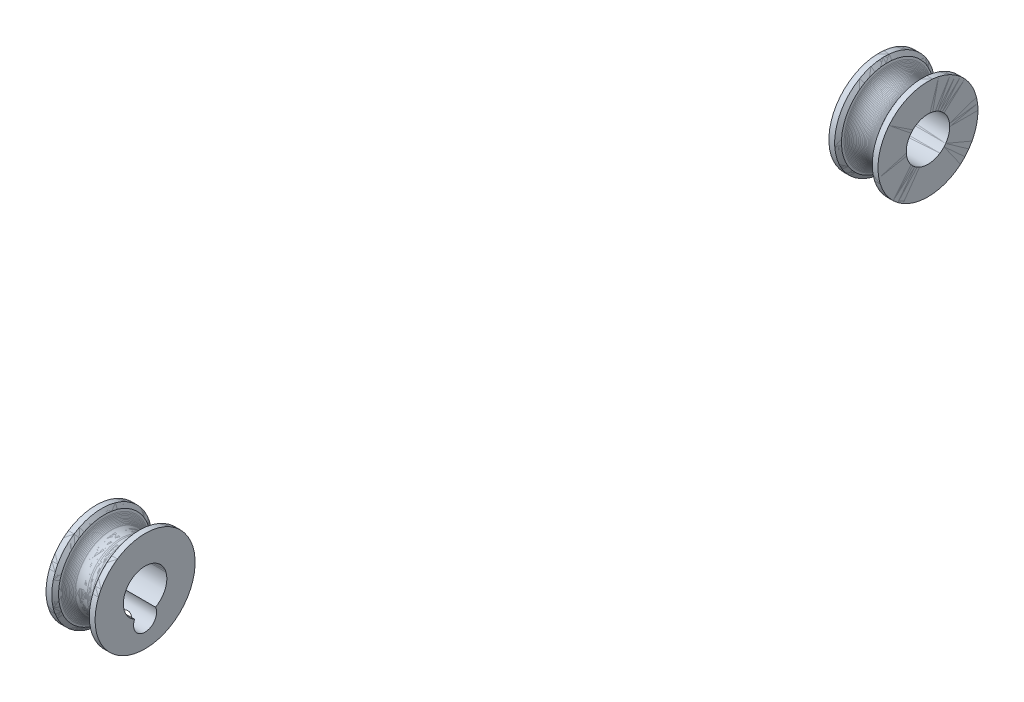
ISO-10303-21;
HEADER;
FILE_DESCRIPTION(('STEP AP214'),'2;1');
FILE_NAME('part.step','',(''),(''),'','','');
FILE_SCHEMA(('AUTOMOTIVE_DESIGN { 1 0 10303 214 1 1 1 1 }'));
ENDSEC;
DATA;
#1=APPLICATION_CONTEXT('core data for automotive mechanical design processes');
#2=APPLICATION_PROTOCOL_DEFINITION('international standard','automotive_design',2000,#1);
#3=PRODUCT_CONTEXT('',#1,'mechanical');
#4=PRODUCT('Part','Part','',(#3));
#5=PRODUCT_RELATED_PRODUCT_CATEGORY('part','',(#4));
#6=PRODUCT_DEFINITION_FORMATION('','',#4);
#7=PRODUCT_DEFINITION_CONTEXT('part definition',#1,'design');
#8=PRODUCT_DEFINITION('design','',#6,#7);
#9=PRODUCT_DEFINITION_SHAPE('','',#8);
#10=(LENGTH_UNIT() NAMED_UNIT(*) SI_UNIT(.MILLI.,.METRE.));
#11=(NAMED_UNIT(*) PLANE_ANGLE_UNIT() SI_UNIT($,.RADIAN.));
#12=(NAMED_UNIT(*) SI_UNIT($,.STERADIAN.) SOLID_ANGLE_UNIT());
#13=UNCERTAINTY_MEASURE_WITH_UNIT(LENGTH_MEASURE(1.E-05),#10,'distance_accuracy_value','');
#14=(GEOMETRIC_REPRESENTATION_CONTEXT(3) GLOBAL_UNCERTAINTY_ASSIGNED_CONTEXT((#13)) GLOBAL_UNIT_ASSIGNED_CONTEXT((#10,
#11,#12)) REPRESENTATION_CONTEXT('',''));
#15=CARTESIAN_POINT('',(0.,0.,0.));
#16=DIRECTION('',(0.,0.,1.));
#17=DIRECTION('',(1.,0.,0.));
#18=AXIS2_PLACEMENT_3D('',#15,#16,#17);
#19=CARTESIAN_POINT('',(102.4128,-70.8025,2.22250000000007));
#20=DIRECTION('',(1.,0.,0.));
#21=DIRECTION('',(0.,0.,1.));
#22=AXIS2_PLACEMENT_3D('',#19,#20,#21);
#23=PLANE('',#22);
#24=CARTESIAN_POINT('',(102.4128,-70.8025,12.7));
#25=DIRECTION('',(1.,0.,0.));
#26=DIRECTION('',(0.,0.,-1.));
#27=AXIS2_PLACEMENT_3D('',#24,#25,#26);
#28=CIRCLE('',#27,6.35);
#29=CARTESIAN_POINT('',(102.4128,-70.8025,6.35));
#30=VERTEX_POINT('',#29);
#31=EDGE_CURVE('P0_E43',#30,#30,#28,.T.);
#32=ORIENTED_EDGE('',*,*,#31,.F.);
#33=EDGE_LOOP('',(#32));
#34=FACE_BOUND('',#33,.T.);
#35=CARTESIAN_POINT('',(102.4128,-70.8025,12.7));
#36=DIRECTION('',(1.,0.,0.));
#37=DIRECTION('',(0.,0.,-1.));
#38=AXIS2_PLACEMENT_3D('',#35,#36,#37);
#39=CIRCLE('',#38,14.605);
#40=CARTESIAN_POINT('',(102.4128,-70.8025,-1.905));
#41=VERTEX_POINT('',#40);
#42=EDGE_CURVE('P0_E10',#41,#41,#39,.T.);
#43=ORIENTED_EDGE('',*,*,#42,.T.);
#44=EDGE_LOOP('',(#43));
#45=FACE_BOUND('',#44,.T.);
#46=ADVANCED_FACE('P0_F15',(#34,#45),#23,.T.);
#47=CARTESIAN_POINT('',(95.25,-70.8025,12.7));
#48=DIRECTION('',(-1.,0.,0.));
#49=DIRECTION('',(0.,0.,-1.));
#50=AXIS2_PLACEMENT_3D('',#47,#48,#49);
#51=CYLINDRICAL_SURFACE('',#50,14.605);
#52=ORIENTED_EDGE('',*,*,#42,.F.);
#53=EDGE_LOOP('',(#52));
#54=FACE_BOUND('',#53,.T.);
#55=CARTESIAN_POINT('',(100.7364,-70.8025,12.7));
#56=DIRECTION('',(1.,0.,0.));
#57=DIRECTION('',(0.,0.,-1.));
#58=AXIS2_PLACEMENT_3D('',#55,#56,#57);
#59=CIRCLE('',#58,14.605);
#60=CARTESIAN_POINT('',(100.7364,-70.8025,-1.905));
#61=VERTEX_POINT('',#60);
#62=EDGE_CURVE('P0_E21',#61,#61,#59,.T.);
#63=ORIENTED_EDGE('',*,*,#62,.T.);
#64=EDGE_LOOP('',(#63));
#65=FACE_BOUND('',#64,.T.);
#66=ADVANCED_FACE('P0_F50',(#54,#65),#51,.T.);
#67=CARTESIAN_POINT('',(100.7364,-70.8025,12.7));
#68=DIRECTION('',(1.,0.,0.));
#69=DIRECTION('',(0.,0.,1.));
#70=AXIS2_PLACEMENT_3D('',#67,#68,#69);
#71=CONICAL_SURFACE('',#70,14.605,0.938047491792709);
#72=CARTESIAN_POINT('',(99.8982,-70.8025,12.7));
#73=DIRECTION('',(1.,0.,0.));
#74=DIRECTION('',(0.,0.,-1.));
#75=AXIS2_PLACEMENT_3D('',#72,#73,#74);
#76=CIRCLE('',#75,13.462);
#77=CARTESIAN_POINT('',(99.8982,-70.8025,-0.762000000000001));
#78=VERTEX_POINT('',#77);
#79=EDGE_CURVE('P0_E25',#78,#78,#76,.T.);
#80=ORIENTED_EDGE('',*,*,#79,.T.);
#81=EDGE_LOOP('',(#80));
#82=FACE_BOUND('',#81,.T.);
#83=ORIENTED_EDGE('',*,*,#62,.F.);
#84=EDGE_LOOP('',(#83));
#85=FACE_BOUND('',#84,.T.);
#86=ADVANCED_FACE('P0_F55',(#82,#85),#71,.T.);
#87=CARTESIAN_POINT('',(95.25,-70.8025,12.7));
#88=DIRECTION('',(-1.,0.,0.));
#89=DIRECTION('',(0.,0.,-1.));
#90=AXIS2_PLACEMENT_3D('',#87,#88,#89);
#91=TOROIDAL_SURFACE('',#90,14.605,4.78667026647959);
#92=ORIENTED_EDGE('',*,*,#79,.F.);
#93=EDGE_LOOP('',(#92));
#94=FACE_BOUND('',#93,.T.);
#95=CARTESIAN_POINT('',(90.6018,-70.8025,12.7));
#96=DIRECTION('',(1.,0.,0.));
#97=DIRECTION('',(0.,0.,-1.));
#98=AXIS2_PLACEMENT_3D('',#95,#96,#97);
#99=CIRCLE('',#98,13.462);
#100=CARTESIAN_POINT('',(90.6018,-70.8025,-0.762000000000001));
#101=VERTEX_POINT('',#100);
#102=EDGE_CURVE('P0_E29',#101,#101,#99,.T.);
#103=ORIENTED_EDGE('',*,*,#102,.T.);
#104=EDGE_LOOP('',(#103));
#105=FACE_BOUND('',#104,.T.);
#106=ADVANCED_FACE('P0_F60',(#94,#105),#91,.F.);
#107=CARTESIAN_POINT('',(89.7636,-70.8025,12.7));
#108=DIRECTION('',(-1.,0.,0.));
#109=DIRECTION('',(0.,0.,-1.));
#110=AXIS2_PLACEMENT_3D('',#107,#108,#109);
#111=CONICAL_SURFACE('',#110,14.605,0.938047491792693);
#112=ORIENTED_EDGE('',*,*,#102,.F.);
#113=EDGE_LOOP('',(#112));
#114=FACE_BOUND('',#113,.T.);
#115=CARTESIAN_POINT('',(89.7636,-70.8025,12.7));
#116=DIRECTION('',(1.,0.,0.));
#117=DIRECTION('',(0.,0.,-1.));
#118=AXIS2_PLACEMENT_3D('',#115,#116,#117);
#119=CIRCLE('',#118,14.605);
#120=CARTESIAN_POINT('',(89.7636,-70.8025,-1.905));
#121=VERTEX_POINT('',#120);
#122=EDGE_CURVE('P0_E34',#121,#121,#119,.T.);
#123=ORIENTED_EDGE('',*,*,#122,.T.);
#124=EDGE_LOOP('',(#123));
#125=FACE_BOUND('',#124,.T.);
#126=ADVANCED_FACE('P0_F66',(#114,#125),#111,.T.);
#127=CARTESIAN_POINT('',(95.25,-70.8025,12.7));
#128=DIRECTION('',(-1.,0.,0.));
#129=DIRECTION('',(0.,0.,-1.));
#130=AXIS2_PLACEMENT_3D('',#127,#128,#129);
#131=CYLINDRICAL_SURFACE('',#130,14.605);
#132=ORIENTED_EDGE('',*,*,#122,.F.);
#133=EDGE_LOOP('',(#132));
#134=FACE_BOUND('',#133,.T.);
#135=CARTESIAN_POINT('',(88.0872,-70.8025,12.7));
#136=DIRECTION('',(1.,0.,0.));
#137=DIRECTION('',(0.,0.,-1.));
#138=AXIS2_PLACEMENT_3D('',#135,#136,#137);
#139=CIRCLE('',#138,14.605);
#140=CARTESIAN_POINT('',(88.0872,-70.8025,-1.905));
#141=VERTEX_POINT('',#140);
#142=EDGE_CURVE('P0_E37',#141,#141,#139,.T.);
#143=ORIENTED_EDGE('',*,*,#142,.T.);
#144=EDGE_LOOP('',(#143));
#145=FACE_BOUND('',#144,.T.);
#146=ADVANCED_FACE('P0_F70',(#134,#145),#131,.T.);
#147=CARTESIAN_POINT('',(88.0872,-70.8025,2.22250000000007));
#148=DIRECTION('',(-1.,0.,0.));
#149=DIRECTION('',(0.,0.,-1.));
#150=AXIS2_PLACEMENT_3D('',#147,#148,#149);
#151=PLANE('',#150);
#152=ORIENTED_EDGE('',*,*,#142,.F.);
#153=EDGE_LOOP('',(#152));
#154=FACE_BOUND('',#153,.T.);
#155=CARTESIAN_POINT('',(88.0872,-70.8025,12.7));
#156=DIRECTION('',(1.,0.,0.));
#157=DIRECTION('',(0.,0.,-1.));
#158=AXIS2_PLACEMENT_3D('',#155,#156,#157);
#159=CIRCLE('',#158,6.35);
#160=CARTESIAN_POINT('',(88.0872,-70.8025,6.35));
#161=VERTEX_POINT('',#160);
#162=EDGE_CURVE('P0_E40',#161,#161,#159,.T.);
#163=ORIENTED_EDGE('',*,*,#162,.T.);
#164=EDGE_LOOP('',(#163));
#165=FACE_BOUND('',#164,.T.);
#166=ADVANCED_FACE('P0_F74',(#154,#165),#151,.T.);
#167=CARTESIAN_POINT('',(95.25,-70.8025,12.7));
#168=DIRECTION('',(-1.,0.,0.));
#169=DIRECTION('',(0.,0.,-1.));
#170=AXIS2_PLACEMENT_3D('',#167,#168,#169);
#171=CYLINDRICAL_SURFACE('',#170,6.35);
#172=ORIENTED_EDGE('',*,*,#162,.F.);
#173=EDGE_LOOP('',(#172));
#174=FACE_BOUND('',#173,.T.);
#175=ORIENTED_EDGE('',*,*,#31,.T.);
#176=EDGE_LOOP('',(#175));
#177=FACE_BOUND('',#176,.T.);
#178=ADVANCED_FACE('P0_F47',(#174,#177),#171,.F.);
#179=CLOSED_SHELL('',(#46,#66,#86,#106,#126,#146,#166,#178));
#180=MANIFOLD_SOLID_BREP('P0_B1',#179);
#181=CARTESIAN_POINT('',(102.4128,-70.8025,251.7775));
#182=DIRECTION('',(1.,0.,0.));
#183=DIRECTION('',(0.,0.,-1.));
#184=AXIS2_PLACEMENT_3D('',#181,#182,#183);
#185=PLANE('',#184);
#186=CARTESIAN_POINT('',(102.4128,-77.7875,241.3));
#187=DIRECTION('',(1.,0.,0.));
#188=DIRECTION('',(0.,0.,-1.));
#189=AXIS2_PLACEMENT_3D('',#186,#187,#188);
#190=CIRCLE('',#189,3.3655);
#191=CARTESIAN_POINT('',(102.4128,-76.3705840909091,244.352693819656));
#192=VERTEX_POINT('',#191);
#193=CARTESIAN_POINT('',(102.4128,-76.370584090909,238.247306180344));
#194=VERTEX_POINT('',#193);
#195=EDGE_CURVE('P1_E30',#192,#194,#190,.T.);
#196=ORIENTED_EDGE('',*,*,#195,.F.);
#197=CARTESIAN_POINT('',(102.4128,-70.8025,241.3));
#198=DIRECTION('',(-1.,0.,0.));
#199=DIRECTION('',(0.,0.,1.));
#200=AXIS2_PLACEMENT_3D('',#197,#198,#199);
#201=CIRCLE('',#200,6.35);
#202=EDGE_CURVE('P1_E54',#192,#194,#201,.T.);
#203=ORIENTED_EDGE('',*,*,#202,.T.);
#204=EDGE_LOOP('',(#196,#203));
#205=FACE_BOUND('',#204,.T.);
#206=CARTESIAN_POINT('',(102.4128,-70.8025,241.3));
#207=DIRECTION('',(-1.,0.,0.));
#208=DIRECTION('',(0.,0.,1.));
#209=AXIS2_PLACEMENT_3D('',#206,#207,#208);
#210=CIRCLE('',#209,14.605);
#211=CARTESIAN_POINT('',(102.4128,-70.8025,255.905));
#212=VERTEX_POINT('',#211);
#213=EDGE_CURVE('P1_E45',#212,#212,#210,.T.);
#214=ORIENTED_EDGE('',*,*,#213,.F.);
#215=EDGE_LOOP('',(#214));
#216=FACE_BOUND('',#215,.T.);
#217=ADVANCED_FACE('P1_F17',(#205,#216),#185,.T.);
#218=CARTESIAN_POINT('',(95.25,-70.8025,241.3));
#219=DIRECTION('',(-1.,0.,0.));
#220=DIRECTION('',(0.,0.,1.));
#221=AXIS2_PLACEMENT_3D('',#218,#219,#220);
#222=CYLINDRICAL_SURFACE('',#221,14.605);
#223=ORIENTED_EDGE('',*,*,#213,.T.);
#224=EDGE_LOOP('',(#223));
#225=FACE_BOUND('',#224,.T.);
#226=CARTESIAN_POINT('',(100.7364,-70.8025,241.3));
#227=DIRECTION('',(-1.,0.,0.));
#228=DIRECTION('',(0.,0.,1.));
#229=AXIS2_PLACEMENT_3D('',#226,#227,#228);
#230=CIRCLE('',#229,14.605);
#231=CARTESIAN_POINT('',(100.7364,-70.8025,255.905));
#232=VERTEX_POINT('',#231);
#233=EDGE_CURVE('P1_E71',#232,#232,#230,.T.);
#234=ORIENTED_EDGE('',*,*,#233,.F.);
#235=EDGE_LOOP('',(#234));
#236=FACE_BOUND('',#235,.T.);
#237=ADVANCED_FACE('P1_F77',(#225,#236),#222,.T.);
#238=CARTESIAN_POINT('',(100.7364,-70.8025,241.3));
#239=DIRECTION('',(1.,0.,0.));
#240=DIRECTION('',(0.,0.,-1.));
#241=AXIS2_PLACEMENT_3D('',#238,#239,#240);
#242=CONICAL_SURFACE('',#241,14.605,0.938047491792709);
#243=CARTESIAN_POINT('',(99.8982,-70.8025,241.3));
#244=DIRECTION('',(-1.,0.,0.));
#245=DIRECTION('',(0.,0.,1.));
#246=AXIS2_PLACEMENT_3D('',#243,#244,#245);
#247=CIRCLE('',#246,13.462);
#248=CARTESIAN_POINT('',(99.8982,-70.8025,254.762));
#249=VERTEX_POINT('',#248);
#250=EDGE_CURVE('P1_E68',#249,#249,#247,.T.);
#251=ORIENTED_EDGE('',*,*,#250,.F.);
#252=EDGE_LOOP('',(#251));
#253=FACE_BOUND('',#252,.T.);
#254=ORIENTED_EDGE('',*,*,#233,.T.);
#255=EDGE_LOOP('',(#254));
#256=FACE_BOUND('',#255,.T.);
#257=ADVANCED_FACE('P1_F86',(#253,#256),#242,.T.);
#258=CARTESIAN_POINT('',(95.25,-70.8025,241.3));
#259=DIRECTION('',(-1.,0.,0.));
#260=DIRECTION('',(0.,0.,1.));
#261=AXIS2_PLACEMENT_3D('',#258,#259,#260);
#262=TOROIDAL_SURFACE('',#261,14.605,4.78667026647959);
#263=CARTESIAN_POINT('',(93.3120294666594,-80.9728268727951,240.213591722796));
#264=CARTESIAN_POINT('',(93.3650081354483,-80.9384745240016,240.112902921795));
#265=CARTESIAN_POINT('',(93.4262302791657,-80.9005715965524,240.017531788477));
#266=CARTESIAN_POINT('',(93.5643537012766,-80.8214811289982,239.840187384882));
#267=CARTESIAN_POINT('',(93.6412959510597,-80.780285180646,239.758250154342));
#268=CARTESIAN_POINT('',(93.8090927841571,-80.6990199159641,239.609793422558));
#269=CARTESIAN_POINT('',(93.8999232058517,-80.6589487833693,239.54324764012));
#270=CARTESIAN_POINT('',(94.0932034124341,-80.5839858591219,239.426204486387));
#271=CARTESIAN_POINT('',(94.1956467656807,-80.5490912250312,239.375698290174));
#272=CARTESIAN_POINT('',(94.4079910630382,-80.4882341398288,239.291190635299));
#273=CARTESIAN_POINT('',(94.5177834373758,-80.4621660176732,239.256991759265));
#274=CARTESIAN_POINT('',(94.7429378272002,-80.4206779582629,239.203786894585));
#275=CARTESIAN_POINT('',(94.858301278688,-80.4052607822399,239.184784845478));
#276=CARTESIAN_POINT('',(95.0943872180407,-80.3861420864803,239.161334268545));
#277=CARTESIAN_POINT('',(95.2151715912685,-80.3827427366672,239.1572610115));
#278=CARTESIAN_POINT('',(95.4559507302906,-80.3887928972979,239.164611079543));
#279=CARTESIAN_POINT('',(95.5759454398539,-80.3982433130201,239.176035496457));
#280=CARTESIAN_POINT('',(95.8129516793368,-80.4293360288543,239.214834991924));
#281=CARTESIAN_POINT('',(95.9299222156635,-80.4510974282141,239.242365979257));
#282=CARTESIAN_POINT('',(96.1561894315912,-80.5048906302805,239.31395642246));
#283=CARTESIAN_POINT('',(96.2654873566333,-80.5369207614151,239.358013188418));
#284=CARTESIAN_POINT('',(96.4717778894243,-80.6076011186977,239.462200003978));
#285=CARTESIAN_POINT('',(96.568917236278,-80.6461557060974,239.522104043334));
#286=CARTESIAN_POINT('',(96.7499184353854,-80.7262337658516,239.657861407208));
#287=CARTESIAN_POINT('',(96.8337826591529,-80.7677567060011,239.733711877352));
#288=CARTESIAN_POINT('',(96.9843476789951,-80.848370737955,239.897930578737));
#289=CARTESIAN_POINT('',(97.0514308451207,-80.887496822819,239.985931256971));
#290=CARTESIAN_POINT('',(97.1700863109184,-80.9605602297592,240.17375806294));
#291=CARTESIAN_POINT('',(97.2216587702385,-80.9944976052399,240.273584068946));
#292=CARTESIAN_POINT('',(97.3081585472786,-81.053486256406,240.480652181236));
#293=CARTESIAN_POINT('',(97.3433345769732,-81.0786687282594,240.587753181679));
#294=CARTESIAN_POINT('',(97.3981635788844,-81.1186766978568,240.807712859846));
#295=CARTESIAN_POINT('',(97.4178160967031,-81.1335018924252,240.920571706008));
#296=CARTESIAN_POINT('',(97.4416175863261,-81.1515287732499,241.148533256537));
#297=CARTESIAN_POINT('',(97.44580535074,-81.1547595430026,241.263629617337));
#298=CARTESIAN_POINT('',(97.438805572815,-81.1494160152563,241.493078091922));
#299=CARTESIAN_POINT('',(97.4276181528911,-81.1408418117468,241.607430211625));
#300=CARTESIAN_POINT('',(97.3898110054314,-81.1125836717822,241.832209034926));
#301=CARTESIAN_POINT('',(97.3631826783278,-81.0928935446518,241.942633514685));
#302=CARTESIAN_POINT('',(97.2944664061935,-81.0440740460528,242.156346918318));
#303=CARTESIAN_POINT('',(97.252379703918,-81.0149454334005,242.259636415007));
#304=CARTESIAN_POINT('',(97.1529688121137,-80.9498679321103,242.456172213147));
#305=CARTESIAN_POINT('',(97.0956533582838,-80.9139229569294,242.549424229463));
#306=CARTESIAN_POINT('',(96.9664299795248,-80.8385663925818,242.723586495433));
#307=CARTESIAN_POINT('',(96.894522833317,-80.7991549884732,242.804497403297));
#308=CARTESIAN_POINT('',(96.7371212153471,-80.7205091651745,242.952610342426));
#309=CARTESIAN_POINT('',(96.6515782678955,-80.6812759113498,243.019761433558));
#310=CARTESIAN_POINT('',(96.469074935179,-80.6069057048543,243.139159305218));
#311=CARTESIAN_POINT('',(96.3721131027718,-80.5717692725087,243.191404193769));
#312=CARTESIAN_POINT('',(96.1675441069052,-80.5083084084876,243.281641398262));
#313=CARTESIAN_POINT('',(96.0597824443636,-80.4801116308059,243.319372928092));
#314=CARTESIAN_POINT('',(95.8380034964663,-80.4338597023563,243.379620378703));
#315=CARTESIAN_POINT('',(95.7239848804105,-80.4158067181708,243.402133049141));
#316=CARTESIAN_POINT('',(95.4898651224722,-80.3910661906394,243.432706676239));
#317=CARTESIAN_POINT('',(95.3696831247745,-80.3846758940003,243.440389949095));
#318=CARTESIAN_POINT('',(95.1293159480514,-80.3847097927152,243.440348110925));
#319=CARTESIAN_POINT('',(95.009130769974,-80.3911353085458,243.432621412135));
#320=CARTESIAN_POINT('',(94.7706178596123,-80.4164148395099,243.401381417695));
#321=CARTESIAN_POINT('',(94.6523316878444,-80.4354221030505,243.377673399956));
#322=CARTESIAN_POINT('',(94.4226345158232,-80.4842887220411,243.313833315121));
#323=CARTESIAN_POINT('',(94.3112225518256,-80.5141465522099,243.273703556354));
#324=CARTESIAN_POINT('',(94.0997332437634,-80.5814372017546,243.177207614892));
#325=CARTESIAN_POINT('',(93.9995447527636,-80.6187831325926,243.121024786366));
#326=CARTESIAN_POINT('',(93.8119422741566,-80.697454010864,242.992457399764));
#327=CARTESIAN_POINT('',(93.7245258208632,-80.7387781877209,242.920075975734));
#328=CARTESIAN_POINT('',(93.5666307120315,-80.8200173567416,242.762221523451));
#329=CARTESIAN_POINT('',(93.4957802807517,-80.8599415932751,242.677124978321));
#330=CARTESIAN_POINT('',(93.3694907601769,-80.9354484001304,242.494471671695));
#331=CARTESIAN_POINT('',(93.3140514384271,-80.9710310359344,242.396915098172));
#332=CARTESIAN_POINT('',(93.2199958436583,-81.0338560545792,242.193792450118));
#333=CARTESIAN_POINT('',(93.1811021854445,-81.0612334756598,242.088396387954));
#334=CARTESIAN_POINT('',(93.1188764582225,-81.1060438664106,241.871103684076));
#335=CARTESIAN_POINT('',(93.0955433475057,-81.1234775017613,241.759207478061));
#336=CARTESIAN_POINT('',(93.0644520202189,-81.1468823653866,241.532542050706));
#337=CARTESIAN_POINT('',(93.056635244997,-81.1528966864012,241.417785292756));
#338=CARTESIAN_POINT('',(93.056368327033,-81.15310067446,241.188175130394));
#339=CARTESIAN_POINT('',(93.0639264950784,-81.1472839463368,241.073321707275));
#340=CARTESIAN_POINT('',(93.0944692978705,-81.1242803696664,240.84668753525));
#341=CARTESIAN_POINT('',(93.1174780079859,-81.1070757769013,240.734911865567));
#342=CARTESIAN_POINT('',(93.1789694790315,-81.0627460099943,240.517985007428));
#343=CARTESIAN_POINT('',(93.2174129270952,-81.0356460554736,240.412817768188));
#344=CARTESIAN_POINT('',(93.278779106639,-80.9945729456431,240.278959836414));
#345=CARTESIAN_POINT('',(93.2949772761071,-80.9838838285649,240.246000325361));
#346=CARTESIAN_POINT('',(93.3120294666594,-80.9728268727951,240.213591722796));
#347=B_SPLINE_CURVE_WITH_KNOTS('',3,(#263,#264,#265,#266,#267,#268,#269,#270,#271,#272,#273,
#274,#275,#276,#277,#278,#279,#280,#281,#282,#283,#284,#285,#286,#287,#288,#289,#290,#291,#292,
#293,#294,#295,#296,#297,#298,#299,#300,#301,#302,#303,#304,#305,#306,#307,#308,#309,#310,#311,
#312,#313,#314,#315,#316,#317,#318,#319,#320,#321,#322,#323,#324,#325,#326,#327,#328,#329,#330,
#331,#332,#333,#334,#335,#336,#337,#338,#339,#340,#341,#342,#343,#344,#345,#346),.UNSPECIFIED.,
.T.,.F.,(4,2,2,2,2,2,2,2,2,2,2,2,2,2,2,2,2,2,2,2,2,2,2,2,2,2,2,2,2,2,2,2,2,2,2,2,2,2,2,2,2,4),
(0.,0.356434165823385,0.713809437801201,1.0705699038183,1.42713374015681,1.77926392277596,
2.13148536005762,2.4925022564403,2.85354458812778,3.21814096411672,3.58267802023172,
3.94227289023109,4.30180344828971,4.65218730252548,5.00256755021647,5.34744460460892,
5.69233175372605,6.03635317963529,6.38037186651162,6.72458233339409,7.06876513399587,
7.41275092499588,7.75671836317987,8.10193706784399,8.44719957006963,8.79840458271056,
9.14968457969092,9.5097988951209,9.86995031682568,10.2345712268426,10.5991409013411,
10.9597024857969,11.3201943703512,11.6715887336775,12.0229777964269,12.3682184918219,
12.7134360725851,13.0573483061714,13.4014464878275,13.7460820987598,14.0898454225735,
14.2045705271088),.UNSPECIFIED.);
#348=CARTESIAN_POINT('',(93.3120294666594,-80.9728268727951,240.213591722796));
#349=VERTEX_POINT('',#348);
#350=EDGE_CURVE('P1_E59',#349,#349,#347,.T.);
#351=ORIENTED_EDGE('',*,*,#350,.F.);
#352=EDGE_LOOP('',(#351));
#353=FACE_BOUND('',#352,.T.);
#354=ORIENTED_EDGE('',*,*,#250,.T.);
#355=EDGE_LOOP('',(#354));
#356=FACE_BOUND('',#355,.T.);
#357=CARTESIAN_POINT('',(90.6018,-70.8025,241.3));
#358=DIRECTION('',(-1.,0.,0.));
#359=DIRECTION('',(0.,0.,1.));
#360=AXIS2_PLACEMENT_3D('',#357,#358,#359);
#361=CIRCLE('',#360,13.462);
#362=CARTESIAN_POINT('',(90.6018,-70.8025,254.762));
#363=VERTEX_POINT('',#362);
#364=EDGE_CURVE('P1_E65',#363,#363,#361,.T.);
#365=ORIENTED_EDGE('',*,*,#364,.F.);
#366=EDGE_LOOP('',(#365));
#367=FACE_BOUND('',#366,.T.);
#368=ADVANCED_FACE('P1_F94',(#353,#356,#367),#262,.F.);
#369=CARTESIAN_POINT('',(89.7636,-70.8025,241.3));
#370=DIRECTION('',(-1.,0.,0.));
#371=DIRECTION('',(0.,0.,1.));
#372=AXIS2_PLACEMENT_3D('',#369,#370,#371);
#373=CONICAL_SURFACE('',#372,14.605,0.938047491792693);
#374=ORIENTED_EDGE('',*,*,#364,.T.);
#375=EDGE_LOOP('',(#374));
#376=FACE_BOUND('',#375,.T.);
#377=CARTESIAN_POINT('',(89.7636,-70.8025,241.3));
#378=DIRECTION('',(-1.,0.,0.));
#379=DIRECTION('',(0.,0.,1.));
#380=AXIS2_PLACEMENT_3D('',#377,#378,#379);
#381=CIRCLE('',#380,14.605);
#382=CARTESIAN_POINT('',(89.7636,-70.8025,255.905));
#383=VERTEX_POINT('',#382);
#384=EDGE_CURVE('P1_E57',#383,#383,#381,.T.);
#385=ORIENTED_EDGE('',*,*,#384,.F.);
#386=EDGE_LOOP('',(#385));
#387=FACE_BOUND('',#386,.T.);
#388=ADVANCED_FACE('P1_F108',(#376,#387),#373,.T.);
#389=CARTESIAN_POINT('',(95.25,-70.8025,241.3));
#390=DIRECTION('',(-1.,0.,0.));
#391=DIRECTION('',(0.,0.,1.));
#392=AXIS2_PLACEMENT_3D('',#389,#390,#391);
#393=CYLINDRICAL_SURFACE('',#392,14.605);
#394=ORIENTED_EDGE('',*,*,#384,.T.);
#395=EDGE_LOOP('',(#394));
#396=FACE_BOUND('',#395,.T.);
#397=CARTESIAN_POINT('',(88.0872,-70.8025,241.3));
#398=DIRECTION('',(-1.,0.,0.));
#399=DIRECTION('',(0.,0.,1.));
#400=AXIS2_PLACEMENT_3D('',#397,#398,#399);
#401=CIRCLE('',#400,14.605);
#402=CARTESIAN_POINT('',(88.0872,-70.8025,255.905));
#403=VERTEX_POINT('',#402);
#404=EDGE_CURVE('P1_E53',#403,#403,#401,.T.);
#405=ORIENTED_EDGE('',*,*,#404,.F.);
#406=EDGE_LOOP('',(#405));
#407=FACE_BOUND('',#406,.T.);
#408=ADVANCED_FACE('P1_F106',(#396,#407),#393,.T.);
#409=CARTESIAN_POINT('',(88.0872,-70.8025,251.7775));
#410=DIRECTION('',(-1.,0.,0.));
#411=DIRECTION('',(0.,0.,1.));
#412=AXIS2_PLACEMENT_3D('',#409,#410,#411);
#413=PLANE('',#412);
#414=CARTESIAN_POINT('',(88.0872,-77.7875,241.3));
#415=DIRECTION('',(-1.,0.,0.));
#416=DIRECTION('',(0.,0.,1.));
#417=AXIS2_PLACEMENT_3D('',#414,#415,#416);
#418=CIRCLE('',#417,3.3655);
#419=CARTESIAN_POINT('',(88.0872,-76.370584090909,238.247306180344));
#420=VERTEX_POINT('',#419);
#421=CARTESIAN_POINT('',(88.0872,-76.3705840909091,244.352693819656));
#422=VERTEX_POINT('',#421);
#423=EDGE_CURVE('P1_E40',#420,#422,#418,.T.);
#424=ORIENTED_EDGE('',*,*,#423,.F.);
#425=CARTESIAN_POINT('',(88.0872,-70.8025,241.3));
#426=DIRECTION('',(-1.,0.,0.));
#427=DIRECTION('',(0.,0.,1.));
#428=AXIS2_PLACEMENT_3D('',#425,#426,#427);
#429=CIRCLE('',#428,6.35);
#430=EDGE_CURVE('P1_E50',#422,#420,#429,.T.);
#431=ORIENTED_EDGE('',*,*,#430,.F.);
#432=EDGE_LOOP('',(#424,#431));
#433=FACE_BOUND('',#432,.T.);
#434=ORIENTED_EDGE('',*,*,#404,.T.);
#435=EDGE_LOOP('',(#434));
#436=FACE_BOUND('',#435,.T.);
#437=ADVANCED_FACE('P1_F48',(#433,#436),#413,.T.);
#438=CARTESIAN_POINT('',(95.25,-70.8025,241.3));
#439=DIRECTION('',(-1.,0.,0.));
#440=DIRECTION('',(0.,0.,1.));
#441=AXIS2_PLACEMENT_3D('',#438,#439,#440);
#442=CYLINDRICAL_SURFACE('',#441,6.35);
#443=DIRECTION('',(-1.,0.,0.));
#444=VECTOR('',#443,1.);
#445=CARTESIAN_POINT('',(95.25,-76.3705840909091,244.352693819656));
#446=LINE('',#445,#444);
#447=EDGE_CURVE('P1_E11',#422,#192,#446,.F.);
#448=ORIENTED_EDGE('',*,*,#447,.F.);
#449=ORIENTED_EDGE('',*,*,#430,.T.);
#450=DIRECTION('',(-1.,0.,0.));
#451=VECTOR('',#450,1.);
#452=CARTESIAN_POINT('',(95.25,-76.370584090909,238.247306180344));
#453=LINE('',#452,#451);
#454=EDGE_CURVE('P1_E24',#194,#420,#453,.T.);
#455=ORIENTED_EDGE('',*,*,#454,.F.);
#456=ORIENTED_EDGE('',*,*,#202,.F.);
#457=EDGE_LOOP('',(#448,#449,#455,#456));
#458=FACE_BOUND('',#457,.T.);
#459=ADVANCED_FACE('P1_F52',(#458),#442,.F.);
#460=CARTESIAN_POINT('',(120.6393,-77.7875,241.3));
#461=DIRECTION('',(-1.,0.,0.));
#462=DIRECTION('',(0.,0.,1.));
#463=AXIS2_PLACEMENT_3D('',#460,#461,#462);
#464=CYLINDRICAL_SURFACE('',#463,3.3655);
#465=ORIENTED_EDGE('',*,*,#350,.T.);
#466=EDGE_LOOP('',(#465));
#467=FACE_BOUND('',#466,.T.);
#468=ORIENTED_EDGE('',*,*,#447,.T.);
#469=ORIENTED_EDGE('',*,*,#195,.T.);
#470=ORIENTED_EDGE('',*,*,#454,.T.);
#471=ORIENTED_EDGE('',*,*,#423,.T.);
#472=EDGE_LOOP('',(#468,#469,#470,#471));
#473=FACE_BOUND('',#472,.T.);
#474=ADVANCED_FACE('P1_F39',(#467,#473),#464,.F.);
#475=CLOSED_SHELL('',(#217,#237,#257,#368,#388,#408,#437,#459,#474));
#476=MANIFOLD_SOLID_BREP('P1_B1',#475);
#477=CARTESIAN_POINT('',(88.0872,-70.8025,251.7775));
#478=DIRECTION('',(-1.,0.,0.));
#479=DIRECTION('',(0.,0.,-1.));
#480=AXIS2_PLACEMENT_3D('',#477,#478,#479);
#481=PLANE('',#480);
#482=CARTESIAN_POINT('',(88.0872,-77.7875,241.3));
#483=DIRECTION('',(-1.,0.,0.));
#484=DIRECTION('',(0.,0.,1.));
#485=AXIS2_PLACEMENT_3D('',#482,#483,#484);
#486=CIRCLE('',#485,3.3655);
#487=CARTESIAN_POINT('',(88.0872,-76.370584090909,238.247306180344));
#488=VERTEX_POINT('',#487);
#489=CARTESIAN_POINT('',(88.0872,-76.3705840909091,244.352693819656));
#490=VERTEX_POINT('',#489);
#491=EDGE_CURVE('P2_E30',#488,#490,#486,.T.);
#492=ORIENTED_EDGE('',*,*,#491,.F.);
#493=CARTESIAN_POINT('',(88.0872,-70.8025,241.3));
#494=DIRECTION('',(-1.,0.,0.));
#495=DIRECTION('',(0.,0.,1.));
#496=AXIS2_PLACEMENT_3D('',#493,#494,#495);
#497=CIRCLE('',#496,6.35);
#498=EDGE_CURVE('P2_E54',#490,#488,#497,.T.);
#499=ORIENTED_EDGE('',*,*,#498,.F.);
#500=EDGE_LOOP('',(#492,#499));
#501=FACE_BOUND('',#500,.T.);
#502=CARTESIAN_POINT('',(88.0872,-70.8025,241.3));
#503=DIRECTION('',(-1.,0.,0.));
#504=DIRECTION('',(0.,0.,1.));
#505=AXIS2_PLACEMENT_3D('',#502,#503,#504);
#506=CIRCLE('',#505,14.605);
#507=CARTESIAN_POINT('',(88.0872,-70.8025,255.905));
#508=VERTEX_POINT('',#507);
#509=EDGE_CURVE('P2_E45',#508,#508,#506,.T.);
#510=ORIENTED_EDGE('',*,*,#509,.T.);
#511=EDGE_LOOP('',(#510));
#512=FACE_BOUND('',#511,.T.);
#513=ADVANCED_FACE('P2_F17',(#501,#512),#481,.T.);
#514=CARTESIAN_POINT('',(95.25,-70.8025,241.3));
#515=DIRECTION('',(1.,0.,0.));
#516=DIRECTION('',(0.,0.,1.));
#517=AXIS2_PLACEMENT_3D('',#514,#515,#516);
#518=CYLINDRICAL_SURFACE('',#517,14.605);
#519=ORIENTED_EDGE('',*,*,#509,.F.);
#520=EDGE_LOOP('',(#519));
#521=FACE_BOUND('',#520,.T.);
#522=CARTESIAN_POINT('',(89.7636,-70.8025,241.3));
#523=DIRECTION('',(-1.,0.,0.));
#524=DIRECTION('',(0.,0.,1.));
#525=AXIS2_PLACEMENT_3D('',#522,#523,#524);
#526=CIRCLE('',#525,14.605);
#527=CARTESIAN_POINT('',(89.7636,-70.8025,255.905));
#528=VERTEX_POINT('',#527);
#529=EDGE_CURVE('P2_E71',#528,#528,#526,.T.);
#530=ORIENTED_EDGE('',*,*,#529,.T.);
#531=EDGE_LOOP('',(#530));
#532=FACE_BOUND('',#531,.T.);
#533=ADVANCED_FACE('P2_F78',(#521,#532),#518,.T.);
#534=CARTESIAN_POINT('',(89.7636,-70.8025,241.3));
#535=DIRECTION('',(-1.,0.,0.));
#536=DIRECTION('',(0.,0.,-1.));
#537=AXIS2_PLACEMENT_3D('',#534,#535,#536);
#538=CONICAL_SURFACE('',#537,14.605,0.938047491792709);
#539=CARTESIAN_POINT('',(90.6018,-70.8025,241.3));
#540=DIRECTION('',(-1.,0.,0.));
#541=DIRECTION('',(0.,0.,1.));
#542=AXIS2_PLACEMENT_3D('',#539,#540,#541);
#543=CIRCLE('',#542,13.462);
#544=CARTESIAN_POINT('',(90.6018,-70.8025,254.762));
#545=VERTEX_POINT('',#544);
#546=EDGE_CURVE('P2_E68',#545,#545,#543,.T.);
#547=ORIENTED_EDGE('',*,*,#546,.T.);
#548=EDGE_LOOP('',(#547));
#549=FACE_BOUND('',#548,.T.);
#550=ORIENTED_EDGE('',*,*,#529,.F.);
#551=EDGE_LOOP('',(#550));
#552=FACE_BOUND('',#551,.T.);
#553=ADVANCED_FACE('P2_F81',(#549,#552),#538,.T.);
#554=CARTESIAN_POINT('',(95.25,-70.8025,241.3));
#555=DIRECTION('',(1.,0.,0.));
#556=DIRECTION('',(0.,0.,1.));
#557=AXIS2_PLACEMENT_3D('',#554,#555,#556);
#558=TOROIDAL_SURFACE('',#557,14.605,4.78667026647959);
#559=CARTESIAN_POINT('',(93.3120294666591,-80.9728268727951,240.213591722796));
#560=CARTESIAN_POINT('',(93.3650081354479,-80.9384745240016,240.112902921795));
#561=CARTESIAN_POINT('',(93.4262302791656,-80.9005715965524,240.017531788477));
#562=CARTESIAN_POINT('',(93.5643537012765,-80.8214811289983,239.840187384882));
#563=CARTESIAN_POINT('',(93.6412959510595,-80.780285180646,239.758250154342));
#564=CARTESIAN_POINT('',(93.8090927841569,-80.6990199159641,239.609793422558));
#565=CARTESIAN_POINT('',(93.8999232058516,-80.6589487833694,239.54324764012));
#566=CARTESIAN_POINT('',(94.0932034124339,-80.5839858591219,239.426204486387));
#567=CARTESIAN_POINT('',(94.1956467656805,-80.5490912250312,239.375698290174));
#568=CARTESIAN_POINT('',(94.407991063038,-80.4882341398288,239.291190635299));
#569=CARTESIAN_POINT('',(94.5177834373755,-80.4621660176732,239.256991759265));
#570=CARTESIAN_POINT('',(94.7429378272,-80.4206779582629,239.203786894585));
#571=CARTESIAN_POINT('',(94.8583012786878,-80.4052607822399,239.184784845478));
#572=CARTESIAN_POINT('',(95.0943872180404,-80.3861420864802,239.161334268545));
#573=CARTESIAN_POINT('',(95.2151715912682,-80.3827427366672,239.1572610115));
#574=CARTESIAN_POINT('',(95.4559507302904,-80.3887928972979,239.164611079543));
#575=CARTESIAN_POINT('',(95.5759454398537,-80.3982433130201,239.176035496457));
#576=CARTESIAN_POINT('',(95.8129516793366,-80.4293360288543,239.214834991924));
#577=CARTESIAN_POINT('',(95.9299222156633,-80.4510974282141,239.242365979257));
#578=CARTESIAN_POINT('',(96.156189431591,-80.5048906302804,239.31395642246));
#579=CARTESIAN_POINT('',(96.265487356633,-80.5369207614151,239.358013188418));
#580=CARTESIAN_POINT('',(96.4717778894241,-80.6076011186977,239.462200003978));
#581=CARTESIAN_POINT('',(96.5689172362779,-80.6461557060973,239.522104043334));
#582=CARTESIAN_POINT('',(96.7499184353853,-80.7262337658516,239.657861407208));
#583=CARTESIAN_POINT('',(96.8337826591526,-80.7677567060011,239.733711877352));
#584=CARTESIAN_POINT('',(96.9843476789949,-80.848370737955,239.897930578737));
#585=CARTESIAN_POINT('',(97.0514308451207,-80.8874968228189,239.985931256971));
#586=CARTESIAN_POINT('',(97.1700863109183,-80.9605602297592,240.17375806294));
#587=CARTESIAN_POINT('',(97.2216587702382,-80.99449760524,240.273584068946));
#588=CARTESIAN_POINT('',(97.3081585472784,-81.0534862564061,240.480652181236));
#589=CARTESIAN_POINT('',(97.3433345769733,-81.0786687282595,240.587753181679));
#590=CARTESIAN_POINT('',(97.3981635788844,-81.1186766978567,240.807712859846));
#591=CARTESIAN_POINT('',(97.4178160967028,-81.1335018924252,240.920571706008));
#592=CARTESIAN_POINT('',(97.4416175863258,-81.1515287732499,241.148533256537));
#593=CARTESIAN_POINT('',(97.44580535074,-81.1547595430026,241.263629617337));
#594=CARTESIAN_POINT('',(97.438805572815,-81.1494160152563,241.493078091922));
#595=CARTESIAN_POINT('',(97.4276181528909,-81.1408418117468,241.607430211625));
#596=CARTESIAN_POINT('',(97.3898110054311,-81.1125836717822,241.832209034926));
#597=CARTESIAN_POINT('',(97.3631826783278,-81.0928935446518,241.942633514685));
#598=CARTESIAN_POINT('',(97.2944664061935,-81.0440740460528,242.156346918318));
#599=CARTESIAN_POINT('',(97.2523797039177,-81.0149454334005,242.259636415007));
#600=CARTESIAN_POINT('',(97.1529688121133,-80.9498679321103,242.456172213147));
#601=CARTESIAN_POINT('',(97.0956533582837,-80.9139229569293,242.549424229463));
#602=CARTESIAN_POINT('',(96.9664299795248,-80.8385663925818,242.723586495433));
#603=CARTESIAN_POINT('',(96.8945228333168,-80.7991549884732,242.804497403297));
#604=CARTESIAN_POINT('',(96.7371212153468,-80.7205091651745,242.952610342426));
#605=CARTESIAN_POINT('',(96.6515782678953,-80.6812759113498,243.019761433558));
#606=CARTESIAN_POINT('',(96.4690749351789,-80.6069057048542,243.139159305218));
#607=CARTESIAN_POINT('',(96.3721131027716,-80.5717692725087,243.191404193769));
#608=CARTESIAN_POINT('',(96.1675441069049,-80.5083084084876,243.281641398262));
#609=CARTESIAN_POINT('',(96.0597824443634,-80.4801116308058,243.319372928092));
#610=CARTESIAN_POINT('',(95.838003496466,-80.4338597023562,243.379620378703));
#611=CARTESIAN_POINT('',(95.7239848804102,-80.4158067181708,243.402133049141));
#612=CARTESIAN_POINT('',(95.4898651224719,-80.3910661906394,243.432706676239));
#613=CARTESIAN_POINT('',(95.3696831247743,-80.3846758940003,243.440389949095));
#614=CARTESIAN_POINT('',(95.1293159480512,-80.3847097927152,243.440348110925));
#615=CARTESIAN_POINT('',(95.0091307699738,-80.3911353085458,243.432621412135));
#616=CARTESIAN_POINT('',(94.7706178596121,-80.4164148395099,243.401381417695));
#617=CARTESIAN_POINT('',(94.6523316878443,-80.4354221030505,243.377673399956));
#618=CARTESIAN_POINT('',(94.4226345158231,-80.4842887220411,243.313833315121));
#619=CARTESIAN_POINT('',(94.3112225518254,-80.5141465522098,243.273703556354));
#620=CARTESIAN_POINT('',(94.0997332437632,-80.5814372017546,243.177207614892));
#621=CARTESIAN_POINT('',(93.9995447527634,-80.6187831325927,243.121024786365));
#622=CARTESIAN_POINT('',(93.8119422741564,-80.697454010864,242.992457399764));
#623=CARTESIAN_POINT('',(93.7245258208629,-80.7387781877209,242.920075975734));
#624=CARTESIAN_POINT('',(93.5666307120312,-80.8200173567416,242.762221523451));
#625=CARTESIAN_POINT('',(93.4957802807516,-80.8599415932752,242.677124978321));
#626=CARTESIAN_POINT('',(93.3694907601768,-80.9354484001304,242.494471671694));
#627=CARTESIAN_POINT('',(93.3140514384268,-80.9710310359344,242.396915098172));
#628=CARTESIAN_POINT('',(93.219995843658,-81.0338560545792,242.193792450118));
#629=CARTESIAN_POINT('',(93.1811021854445,-81.0612334756598,242.088396387954));
#630=CARTESIAN_POINT('',(93.1188764582225,-81.1060438664107,241.871103684075));
#631=CARTESIAN_POINT('',(93.0955433475054,-81.1234775017613,241.759207478061));
#632=CARTESIAN_POINT('',(93.0644520202186,-81.1468823653865,241.532542050706));
#633=CARTESIAN_POINT('',(93.056635244997,-81.1528966864012,241.417785292756));
#634=CARTESIAN_POINT('',(93.056368327033,-81.15310067446,241.188175130394));
#635=CARTESIAN_POINT('',(93.0639264950781,-81.1472839463368,241.073321707275));
#636=CARTESIAN_POINT('',(93.0944692978702,-81.1242803696664,240.84668753525));
#637=CARTESIAN_POINT('',(93.1174780079859,-81.1070757769013,240.734911865567));
#638=CARTESIAN_POINT('',(93.1789694790315,-81.0627460099943,240.517985007429));
#639=CARTESIAN_POINT('',(93.2174129270952,-81.0356460554736,240.412817768188));
#640=CARTESIAN_POINT('',(93.2787791066388,-80.9945729456431,240.278959836414));
#641=CARTESIAN_POINT('',(93.2949772761069,-80.9838838285649,240.246000325361));
#642=CARTESIAN_POINT('',(93.3120294666591,-80.9728268727951,240.213591722796));
#643=B_SPLINE_CURVE_WITH_KNOTS('',3,(#559,#560,#561,#562,#563,#564,#565,#566,#567,#568,#569,
#570,#571,#572,#573,#574,#575,#576,#577,#578,#579,#580,#581,#582,#583,#584,#585,#586,#587,#588,
#589,#590,#591,#592,#593,#594,#595,#596,#597,#598,#599,#600,#601,#602,#603,#604,#605,#606,#607,
#608,#609,#610,#611,#612,#613,#614,#615,#616,#617,#618,#619,#620,#621,#622,#623,#624,#625,#626,
#627,#628,#629,#630,#631,#632,#633,#634,#635,#636,#637,#638,#639,#640,#641,#642),.UNSPECIFIED.,
.T.,.F.,(4,2,2,2,2,2,2,2,2,2,2,2,2,2,2,2,2,2,2,2,2,2,2,2,2,2,2,2,2,2,2,2,2,2,2,2,2,2,2,2,2,4),
(0.,0.356434165823364,0.713809437801223,1.07056990381832,1.42713374015681,1.77926392277592,
2.13148536005751,2.49250225644026,2.85354458812778,3.21814096411669,3.58267802023164,
3.94227289023107,4.30180344828974,4.65218730252552,5.00256755021655,5.34744460460901,
5.69233175372612,6.03635317963537,6.38037186651173,6.72458233339422,7.06876513399602,
7.41275092499606,7.75671836318005,8.10193706784413,8.44719957006977,8.79840458271076,
9.14968457969117,9.50979889512108,9.86995031682583,10.2345712268427,10.5991409013412,
10.9597024857971,11.3201943703513,11.6715887336776,12.0229777964271,12.368218491822,
12.7134360725852,13.0573483061715,13.4014464878276,13.7460820987598,14.0898454225735,
14.2045705271088),.UNSPECIFIED.);
#644=CARTESIAN_POINT('',(93.3120294666591,-80.9728268727951,240.213591722796));
#645=VERTEX_POINT('',#644);
#646=EDGE_CURVE('P2_E59',#645,#645,#643,.T.);
#647=ORIENTED_EDGE('',*,*,#646,.F.);
#648=EDGE_LOOP('',(#647));
#649=FACE_BOUND('',#648,.T.);
#650=ORIENTED_EDGE('',*,*,#546,.F.);
#651=EDGE_LOOP('',(#650));
#652=FACE_BOUND('',#651,.T.);
#653=CARTESIAN_POINT('',(99.8982,-70.8025,241.3));
#654=DIRECTION('',(-1.,0.,0.));
#655=DIRECTION('',(0.,0.,1.));
#656=AXIS2_PLACEMENT_3D('',#653,#654,#655);
#657=CIRCLE('',#656,13.462);
#658=CARTESIAN_POINT('',(99.8982,-70.8025,254.762));
#659=VERTEX_POINT('',#658);
#660=EDGE_CURVE('P2_E65',#659,#659,#657,.T.);
#661=ORIENTED_EDGE('',*,*,#660,.T.);
#662=EDGE_LOOP('',(#661));
#663=FACE_BOUND('',#662,.T.);
#664=ADVANCED_FACE('P2_F85',(#649,#652,#663),#558,.F.);
#665=CARTESIAN_POINT('',(100.7364,-70.8025,241.3));
#666=DIRECTION('',(1.,0.,0.));
#667=DIRECTION('',(0.,0.,1.));
#668=AXIS2_PLACEMENT_3D('',#665,#666,#667);
#669=CONICAL_SURFACE('',#668,14.605,0.938047491792693);
#670=ORIENTED_EDGE('',*,*,#660,.F.);
#671=EDGE_LOOP('',(#670));
#672=FACE_BOUND('',#671,.T.);
#673=CARTESIAN_POINT('',(100.7364,-70.8025,241.3));
#674=DIRECTION('',(-1.,0.,0.));
#675=DIRECTION('',(0.,0.,1.));
#676=AXIS2_PLACEMENT_3D('',#673,#674,#675);
#677=CIRCLE('',#676,14.605);
#678=CARTESIAN_POINT('',(100.7364,-70.8025,255.905));
#679=VERTEX_POINT('',#678);
#680=EDGE_CURVE('P2_E57',#679,#679,#677,.T.);
#681=ORIENTED_EDGE('',*,*,#680,.T.);
#682=EDGE_LOOP('',(#681));
#683=FACE_BOUND('',#682,.T.);
#684=ADVANCED_FACE('P2_F92',(#672,#683),#669,.T.);
#685=CARTESIAN_POINT('',(95.25,-70.8025,241.3));
#686=DIRECTION('',(1.,0.,0.));
#687=DIRECTION('',(0.,0.,1.));
#688=AXIS2_PLACEMENT_3D('',#685,#686,#687);
#689=CYLINDRICAL_SURFACE('',#688,14.605);
#690=ORIENTED_EDGE('',*,*,#680,.F.);
#691=EDGE_LOOP('',(#690));
#692=FACE_BOUND('',#691,.T.);
#693=CARTESIAN_POINT('',(102.4128,-70.8025,241.3));
#694=DIRECTION('',(-1.,0.,0.));
#695=DIRECTION('',(0.,0.,1.));
#696=AXIS2_PLACEMENT_3D('',#693,#694,#695);
#697=CIRCLE('',#696,14.605);
#698=CARTESIAN_POINT('',(102.4128,-70.8025,255.905));
#699=VERTEX_POINT('',#698);
#700=EDGE_CURVE('P2_E53',#699,#699,#697,.T.);
#701=ORIENTED_EDGE('',*,*,#700,.T.);
#702=EDGE_LOOP('',(#701));
#703=FACE_BOUND('',#702,.T.);
#704=ADVANCED_FACE('P2_F115',(#692,#703),#689,.T.);
#705=CARTESIAN_POINT('',(102.4128,-70.8025,251.7775));
#706=DIRECTION('',(1.,0.,0.));
#707=DIRECTION('',(0.,0.,1.));
#708=AXIS2_PLACEMENT_3D('',#705,#706,#707);
#709=PLANE('',#708);
#710=CARTESIAN_POINT('',(102.4128,-77.7875,241.3));
#711=DIRECTION('',(1.,0.,0.));
#712=DIRECTION('',(0.,0.,-1.));
#713=AXIS2_PLACEMENT_3D('',#710,#711,#712);
#714=CIRCLE('',#713,3.3655);
#715=CARTESIAN_POINT('',(102.4128,-76.3705840909091,244.352693819656));
#716=VERTEX_POINT('',#715);
#717=CARTESIAN_POINT('',(102.4128,-76.370584090909,238.247306180344));
#718=VERTEX_POINT('',#717);
#719=EDGE_CURVE('P2_E40',#716,#718,#714,.T.);
#720=ORIENTED_EDGE('',*,*,#719,.F.);
#721=CARTESIAN_POINT('',(102.4128,-70.8025,241.3));
#722=DIRECTION('',(-1.,0.,0.));
#723=DIRECTION('',(0.,0.,1.));
#724=AXIS2_PLACEMENT_3D('',#721,#722,#723);
#725=CIRCLE('',#724,6.35);
#726=EDGE_CURVE('P2_E50',#716,#718,#725,.T.);
#727=ORIENTED_EDGE('',*,*,#726,.T.);
#728=EDGE_LOOP('',(#720,#727));
#729=FACE_BOUND('',#728,.T.);
#730=ORIENTED_EDGE('',*,*,#700,.F.);
#731=EDGE_LOOP('',(#730));
#732=FACE_BOUND('',#731,.T.);
#733=ADVANCED_FACE('P2_F48',(#729,#732),#709,.T.);
#734=CARTESIAN_POINT('',(95.25,-70.8025,241.3));
#735=DIRECTION('',(1.,0.,0.));
#736=DIRECTION('',(0.,0.,1.));
#737=AXIS2_PLACEMENT_3D('',#734,#735,#736);
#738=CYLINDRICAL_SURFACE('',#737,6.35);
#739=DIRECTION('',(-1.,0.,0.));
#740=VECTOR('',#739,1.);
#741=CARTESIAN_POINT('',(95.25,-76.370584090909,238.247306180344));
#742=LINE('',#741,#740);
#743=EDGE_CURVE('P2_E11',#718,#488,#742,.T.);
#744=ORIENTED_EDGE('',*,*,#743,.F.);
#745=ORIENTED_EDGE('',*,*,#726,.F.);
#746=DIRECTION('',(-1.,0.,0.));
#747=VECTOR('',#746,1.);
#748=CARTESIAN_POINT('',(95.25,-76.3705840909091,244.352693819656));
#749=LINE('',#748,#747);
#750=EDGE_CURVE('P2_E24',#490,#716,#749,.F.);
#751=ORIENTED_EDGE('',*,*,#750,.F.);
#752=ORIENTED_EDGE('',*,*,#498,.T.);
#753=EDGE_LOOP('',(#744,#745,#751,#752));
#754=FACE_BOUND('',#753,.T.);
#755=ADVANCED_FACE('P2_F52',(#754),#738,.F.);
#756=CARTESIAN_POINT('',(120.6393,-77.7875,241.3));
#757=DIRECTION('',(-1.,0.,0.));
#758=DIRECTION('',(0.,0.,1.));
#759=AXIS2_PLACEMENT_3D('',#756,#757,#758);
#760=CYLINDRICAL_SURFACE('',#759,3.3655);
#761=ORIENTED_EDGE('',*,*,#646,.T.);
#762=EDGE_LOOP('',(#761));
#763=FACE_BOUND('',#762,.T.);
#764=ORIENTED_EDGE('',*,*,#743,.T.);
#765=ORIENTED_EDGE('',*,*,#491,.T.);
#766=ORIENTED_EDGE('',*,*,#750,.T.);
#767=ORIENTED_EDGE('',*,*,#719,.T.);
#768=EDGE_LOOP('',(#764,#765,#766,#767));
#769=FACE_BOUND('',#768,.T.);
#770=ADVANCED_FACE('P2_F39',(#763,#769),#760,.F.);
#771=CLOSED_SHELL('',(#513,#533,#553,#664,#684,#704,#733,#755,#770));
#772=MANIFOLD_SOLID_BREP('P2_B1',#771);
#773=CARTESIAN_POINT('',(88.0872,-70.8025,2.22250000000007));
#774=DIRECTION('',(-1.,0.,0.));
#775=DIRECTION('',(0.,0.,1.));
#776=AXIS2_PLACEMENT_3D('',#773,#774,#775);
#777=PLANE('',#776);
#778=CARTESIAN_POINT('',(88.0872,-70.8025,12.7));
#779=DIRECTION('',(1.,0.,0.));
#780=DIRECTION('',(0.,0.,-1.));
#781=AXIS2_PLACEMENT_3D('',#778,#779,#780);
#782=CIRCLE('',#781,6.35);
#783=CARTESIAN_POINT('',(88.0872,-70.8025,6.35));
#784=VERTEX_POINT('',#783);
#785=EDGE_CURVE('P3_E43',#784,#784,#782,.T.);
#786=ORIENTED_EDGE('',*,*,#785,.T.);
#787=EDGE_LOOP('',(#786));
#788=FACE_BOUND('',#787,.T.);
#789=CARTESIAN_POINT('',(88.0872,-70.8025,12.7));
#790=DIRECTION('',(1.,0.,0.));
#791=DIRECTION('',(0.,0.,-1.));
#792=AXIS2_PLACEMENT_3D('',#789,#790,#791);
#793=CIRCLE('',#792,14.605);
#794=CARTESIAN_POINT('',(88.0872,-70.8025,-1.905));
#795=VERTEX_POINT('',#794);
#796=EDGE_CURVE('P3_E10',#795,#795,#793,.T.);
#797=ORIENTED_EDGE('',*,*,#796,.F.);
#798=EDGE_LOOP('',(#797));
#799=FACE_BOUND('',#798,.T.);
#800=ADVANCED_FACE('P3_F15',(#788,#799),#777,.T.);
#801=CARTESIAN_POINT('',(95.25,-70.8025,12.7));
#802=DIRECTION('',(1.,0.,0.));
#803=DIRECTION('',(0.,0.,-1.));
#804=AXIS2_PLACEMENT_3D('',#801,#802,#803);
#805=CYLINDRICAL_SURFACE('',#804,14.605);
#806=ORIENTED_EDGE('',*,*,#796,.T.);
#807=EDGE_LOOP('',(#806));
#808=FACE_BOUND('',#807,.T.);
#809=CARTESIAN_POINT('',(89.7636,-70.8025,12.7));
#810=DIRECTION('',(1.,0.,0.));
#811=DIRECTION('',(0.,0.,-1.));
#812=AXIS2_PLACEMENT_3D('',#809,#810,#811);
#813=CIRCLE('',#812,14.605);
#814=CARTESIAN_POINT('',(89.7636,-70.8025,-1.905));
#815=VERTEX_POINT('',#814);
#816=EDGE_CURVE('P3_E21',#815,#815,#813,.T.);
#817=ORIENTED_EDGE('',*,*,#816,.F.);
#818=EDGE_LOOP('',(#817));
#819=FACE_BOUND('',#818,.T.);
#820=ADVANCED_FACE('P3_F62',(#808,#819),#805,.T.);
#821=CARTESIAN_POINT('',(89.7636,-70.8025,12.7));
#822=DIRECTION('',(-1.,0.,0.));
#823=DIRECTION('',(0.,0.,1.));
#824=AXIS2_PLACEMENT_3D('',#821,#822,#823);
#825=CONICAL_SURFACE('',#824,14.605,0.938047491792709);
#826=CARTESIAN_POINT('',(90.6018,-70.8025,12.7));
#827=DIRECTION('',(1.,0.,0.));
#828=DIRECTION('',(0.,0.,-1.));
#829=AXIS2_PLACEMENT_3D('',#826,#827,#828);
#830=CIRCLE('',#829,13.462);
#831=CARTESIAN_POINT('',(90.6018,-70.8025,-0.762000000000001));
#832=VERTEX_POINT('',#831);
#833=EDGE_CURVE('P3_E25',#832,#832,#830,.T.);
#834=ORIENTED_EDGE('',*,*,#833,.F.);
#835=EDGE_LOOP('',(#834));
#836=FACE_BOUND('',#835,.T.);
#837=ORIENTED_EDGE('',*,*,#816,.T.);
#838=EDGE_LOOP('',(#837));
#839=FACE_BOUND('',#838,.T.);
#840=ADVANCED_FACE('P3_F66',(#836,#839),#825,.T.);
#841=CARTESIAN_POINT('',(95.25,-70.8025,12.7));
#842=DIRECTION('',(1.,0.,0.));
#843=DIRECTION('',(0.,0.,-1.));
#844=AXIS2_PLACEMENT_3D('',#841,#842,#843);
#845=TOROIDAL_SURFACE('',#844,14.605,4.78667026647959);
#846=ORIENTED_EDGE('',*,*,#833,.T.);
#847=EDGE_LOOP('',(#846));
#848=FACE_BOUND('',#847,.T.);
#849=CARTESIAN_POINT('',(99.8982,-70.8025,12.7));
#850=DIRECTION('',(1.,0.,0.));
#851=DIRECTION('',(0.,0.,-1.));
#852=AXIS2_PLACEMENT_3D('',#849,#850,#851);
#853=CIRCLE('',#852,13.462);
#854=CARTESIAN_POINT('',(99.8982,-70.8025,-0.762000000000001));
#855=VERTEX_POINT('',#854);
#856=EDGE_CURVE('P3_E29',#855,#855,#853,.T.);
#857=ORIENTED_EDGE('',*,*,#856,.F.);
#858=EDGE_LOOP('',(#857));
#859=FACE_BOUND('',#858,.T.);
#860=ADVANCED_FACE('P3_F70',(#848,#859),#845,.F.);
#861=CARTESIAN_POINT('',(100.7364,-70.8025,12.7));
#862=DIRECTION('',(1.,0.,0.));
#863=DIRECTION('',(0.,0.,-1.));
#864=AXIS2_PLACEMENT_3D('',#861,#862,#863);
#865=CONICAL_SURFACE('',#864,14.605,0.938047491792693);
#866=ORIENTED_EDGE('',*,*,#856,.T.);
#867=EDGE_LOOP('',(#866));
#868=FACE_BOUND('',#867,.T.);
#869=CARTESIAN_POINT('',(100.7364,-70.8025,12.7));
#870=DIRECTION('',(1.,0.,0.));
#871=DIRECTION('',(0.,0.,-1.));
#872=AXIS2_PLACEMENT_3D('',#869,#870,#871);
#873=CIRCLE('',#872,14.605);
#874=CARTESIAN_POINT('',(100.7364,-70.8025,-1.905));
#875=VERTEX_POINT('',#874);
#876=EDGE_CURVE('P3_E34',#875,#875,#873,.T.);
#877=ORIENTED_EDGE('',*,*,#876,.F.);
#878=EDGE_LOOP('',(#877));
#879=FACE_BOUND('',#878,.T.);
#880=ADVANCED_FACE('P3_F77',(#868,#879),#865,.T.);
#881=CARTESIAN_POINT('',(95.25,-70.8025,12.7));
#882=DIRECTION('',(1.,0.,0.));
#883=DIRECTION('',(0.,0.,-1.));
#884=AXIS2_PLACEMENT_3D('',#881,#882,#883);
#885=CYLINDRICAL_SURFACE('',#884,14.605);
#886=ORIENTED_EDGE('',*,*,#876,.T.);
#887=EDGE_LOOP('',(#886));
#888=FACE_BOUND('',#887,.T.);
#889=CARTESIAN_POINT('',(102.4128,-70.8025,12.7));
#890=DIRECTION('',(1.,0.,0.));
#891=DIRECTION('',(0.,0.,-1.));
#892=AXIS2_PLACEMENT_3D('',#889,#890,#891);
#893=CIRCLE('',#892,14.605);
#894=CARTESIAN_POINT('',(102.4128,-70.8025,-1.905));
#895=VERTEX_POINT('',#894);
#896=EDGE_CURVE('P3_E37',#895,#895,#893,.T.);
#897=ORIENTED_EDGE('',*,*,#896,.F.);
#898=EDGE_LOOP('',(#897));
#899=FACE_BOUND('',#898,.T.);
#900=ADVANCED_FACE('P3_F58',(#888,#899),#885,.T.);
#901=CARTESIAN_POINT('',(102.4128,-70.8025,2.22250000000007));
#902=DIRECTION('',(1.,0.,0.));
#903=DIRECTION('',(0.,0.,-1.));
#904=AXIS2_PLACEMENT_3D('',#901,#902,#903);
#905=PLANE('',#904);
#906=ORIENTED_EDGE('',*,*,#896,.T.);
#907=EDGE_LOOP('',(#906));
#908=FACE_BOUND('',#907,.T.);
#909=CARTESIAN_POINT('',(102.4128,-70.8025,12.7));
#910=DIRECTION('',(1.,0.,0.));
#911=DIRECTION('',(0.,0.,-1.));
#912=AXIS2_PLACEMENT_3D('',#909,#910,#911);
#913=CIRCLE('',#912,6.35);
#914=CARTESIAN_POINT('',(102.4128,-70.8025,6.35));
#915=VERTEX_POINT('',#914);
#916=EDGE_CURVE('P3_E40',#915,#915,#913,.T.);
#917=ORIENTED_EDGE('',*,*,#916,.F.);
#918=EDGE_LOOP('',(#917));
#919=FACE_BOUND('',#918,.T.);
#920=ADVANCED_FACE('P3_F51',(#908,#919),#905,.T.);
#921=CARTESIAN_POINT('',(95.25,-70.8025,12.7));
#922=DIRECTION('',(1.,0.,0.));
#923=DIRECTION('',(0.,0.,-1.));
#924=AXIS2_PLACEMENT_3D('',#921,#922,#923);
#925=CYLINDRICAL_SURFACE('',#924,6.35);
#926=ORIENTED_EDGE('',*,*,#916,.T.);
#927=EDGE_LOOP('',(#926));
#928=FACE_BOUND('',#927,.T.);
#929=ORIENTED_EDGE('',*,*,#785,.F.);
#930=EDGE_LOOP('',(#929));
#931=FACE_BOUND('',#930,.T.);
#932=ADVANCED_FACE('P3_F49',(#928,#931),#925,.F.);
#933=CLOSED_SHELL('',(#800,#820,#840,#860,#880,#900,#920,#932));
#934=MANIFOLD_SOLID_BREP('P3_B1',#933);
#935=ADVANCED_BREP_SHAPE_REPRESENTATION('',(#18,#180,#476,#772,#934),#14);
#936=SHAPE_DEFINITION_REPRESENTATION(#9,#935);
ENDSEC;
END-ISO-10303-21;
